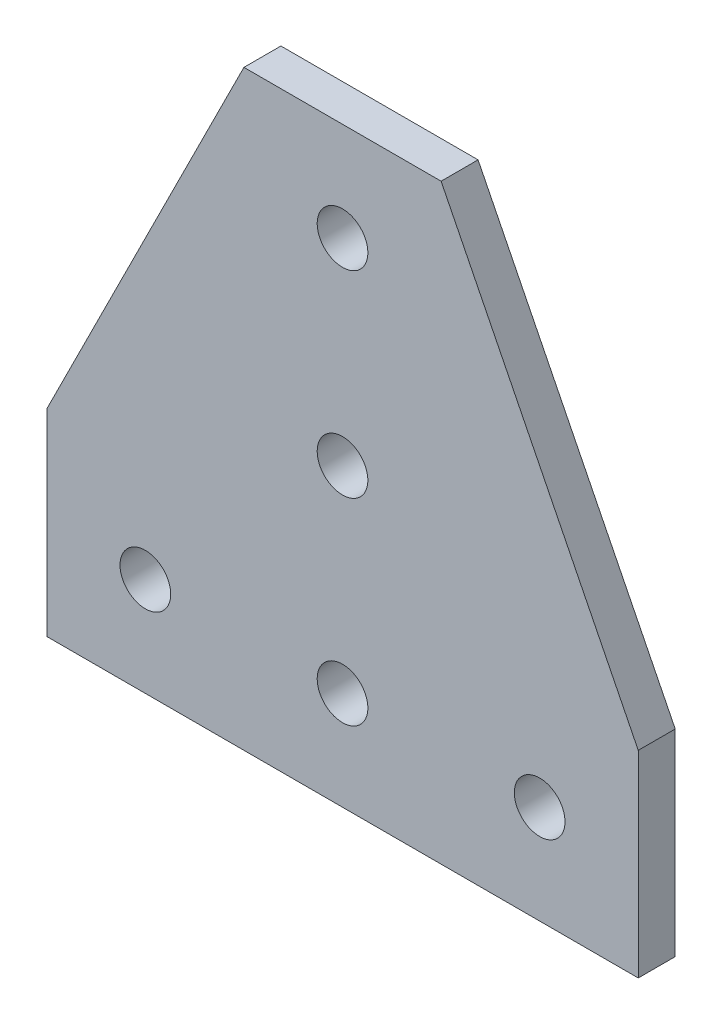
ISO-10303-21;
HEADER;
FILE_DESCRIPTION(('STEP AP214'),'2;1');
FILE_NAME('part.step','',(''),(''),'','','');
FILE_SCHEMA(('AUTOMOTIVE_DESIGN { 1 0 10303 214 1 1 1 1 }'));
ENDSEC;
DATA;
#1=APPLICATION_CONTEXT('core data for automotive mechanical design processes');
#2=APPLICATION_PROTOCOL_DEFINITION('international standard','automotive_design',2000,#1);
#3=PRODUCT_CONTEXT('',#1,'mechanical');
#4=PRODUCT('Part','Part','',(#3));
#5=PRODUCT_RELATED_PRODUCT_CATEGORY('part','',(#4));
#6=PRODUCT_DEFINITION_FORMATION('','',#4);
#7=PRODUCT_DEFINITION_CONTEXT('part definition',#1,'design');
#8=PRODUCT_DEFINITION('design','',#6,#7);
#9=PRODUCT_DEFINITION_SHAPE('','',#8);
#10=(LENGTH_UNIT() NAMED_UNIT(*) SI_UNIT(.MILLI.,.METRE.));
#11=(NAMED_UNIT(*) PLANE_ANGLE_UNIT() SI_UNIT($,.RADIAN.));
#12=(NAMED_UNIT(*) SI_UNIT($,.STERADIAN.) SOLID_ANGLE_UNIT());
#13=UNCERTAINTY_MEASURE_WITH_UNIT(LENGTH_MEASURE(1.E-05),#10,'distance_accuracy_value','');
#14=(GEOMETRIC_REPRESENTATION_CONTEXT(3) GLOBAL_UNCERTAINTY_ASSIGNED_CONTEXT((#13)) GLOBAL_UNIT_ASSIGNED_CONTEXT((#10,
#11,#12)) REPRESENTATION_CONTEXT('',''));
#15=CARTESIAN_POINT('',(0.,0.,0.));
#16=DIRECTION('',(0.,0.,1.));
#17=DIRECTION('',(1.,0.,0.));
#18=AXIS2_PLACEMENT_3D('',#15,#16,#17);
#19=CARTESIAN_POINT('',(0.,0.,2.38125));
#20=DIRECTION('',(0.,0.,-1.));
#21=DIRECTION('',(-1.,0.,0.));
#22=AXIS2_PLACEMENT_3D('',#19,#20,#21);
#23=PLANE('',#22);
#24=CARTESIAN_POINT('',(38.1,63.5,2.38125));
#25=DIRECTION('',(0.,0.,1.));
#26=DIRECTION('',(1.,0.,0.));
#27=AXIS2_PLACEMENT_3D('',#24,#25,#26);
#28=CIRCLE('',#27,3.26390000000001);
#29=CARTESIAN_POINT('',(34.8361,63.5,2.38125));
#30=VERTEX_POINT('',#29);
#31=EDGE_CURVE('E197',#30,#30,#28,.T.);
#32=ORIENTED_EDGE('',*,*,#31,.F.);
#33=EDGE_LOOP('',(#32));
#34=FACE_BOUND('',#33,.T.);
#35=CARTESIAN_POINT('',(38.1,12.7,2.38125));
#36=DIRECTION('',(0.,0.,1.));
#37=DIRECTION('',(1.,0.,0.));
#38=AXIS2_PLACEMENT_3D('',#35,#36,#37);
#39=CIRCLE('',#38,3.26389999999999);
#40=CARTESIAN_POINT('',(34.8361,12.7,2.38125));
#41=VERTEX_POINT('',#40);
#42=EDGE_CURVE('E209',#41,#41,#39,.T.);
#43=ORIENTED_EDGE('',*,*,#42,.F.);
#44=EDGE_LOOP('',(#43));
#45=FACE_BOUND('',#44,.T.);
#46=DIRECTION('',(1.,0.,0.));
#47=VECTOR('',#46,1.);
#48=CARTESIAN_POINT('',(76.2,0.,2.38125));
#49=LINE('',#48,#47);
#50=CARTESIAN_POINT('',(0.,0.,2.38125));
#51=VERTEX_POINT('',#50);
#52=CARTESIAN_POINT('',(76.2,0.,2.38125));
#53=VERTEX_POINT('',#52);
#54=EDGE_CURVE('E132',#51,#53,#49,.T.);
#55=ORIENTED_EDGE('',*,*,#54,.T.);
#56=DIRECTION('',(0.,1.,0.));
#57=VECTOR('',#56,1.);
#58=CARTESIAN_POINT('',(76.2,25.4,2.38125));
#59=LINE('',#58,#57);
#60=CARTESIAN_POINT('',(76.2,25.4,2.38125));
#61=VERTEX_POINT('',#60);
#62=EDGE_CURVE('E90',#53,#61,#59,.T.);
#63=ORIENTED_EDGE('',*,*,#62,.T.);
#64=DIRECTION('',(-0.447213595499958,0.894427190999916,0.));
#65=VECTOR('',#64,1.);
#66=CARTESIAN_POINT('',(76.2,25.4,2.38125));
#67=LINE('',#66,#65);
#68=CARTESIAN_POINT('',(50.8,76.2,2.38125));
#69=VERTEX_POINT('',#68);
#70=EDGE_CURVE('E103',#61,#69,#67,.T.);
#71=ORIENTED_EDGE('',*,*,#70,.T.);
#72=DIRECTION('',(-1.,0.,0.));
#73=VECTOR('',#72,1.);
#74=CARTESIAN_POINT('',(25.4,76.2,2.38125));
#75=LINE('',#74,#73);
#76=CARTESIAN_POINT('',(25.4,76.2,2.38125));
#77=VERTEX_POINT('',#76);
#78=EDGE_CURVE('E97',#69,#77,#75,.T.);
#79=ORIENTED_EDGE('',*,*,#78,.T.);
#80=DIRECTION('',(-0.447213595499958,-0.894427190999916,0.));
#81=VECTOR('',#80,1.);
#82=CARTESIAN_POINT('',(0.,25.4,2.38125));
#83=LINE('',#82,#81);
#84=CARTESIAN_POINT('',(0.,25.4,2.38125));
#85=VERTEX_POINT('',#84);
#86=EDGE_CURVE('E101',#77,#85,#83,.T.);
#87=ORIENTED_EDGE('',*,*,#86,.T.);
#88=DIRECTION('',(0.,-1.,0.));
#89=VECTOR('',#88,1.);
#90=CARTESIAN_POINT('',(0.,0.,2.38125));
#91=LINE('',#90,#89);
#92=EDGE_CURVE('E53',#85,#51,#91,.T.);
#93=ORIENTED_EDGE('',*,*,#92,.T.);
#94=EDGE_LOOP('',(#55,#63,#71,#79,#87,#93));
#95=FACE_BOUND('',#94,.T.);
#96=CARTESIAN_POINT('',(12.7,12.7,2.38125));
#97=DIRECTION('',(0.,0.,1.));
#98=DIRECTION('',(1.,0.,0.));
#99=AXIS2_PLACEMENT_3D('',#96,#97,#98);
#100=CIRCLE('',#99,3.2639);
#101=CARTESIAN_POINT('',(9.4361,12.7,2.38125));
#102=VERTEX_POINT('',#101);
#103=EDGE_CURVE('E125',#102,#102,#100,.T.);
#104=ORIENTED_EDGE('',*,*,#103,.F.);
#105=EDGE_LOOP('',(#104));
#106=FACE_BOUND('',#105,.T.);
#107=CARTESIAN_POINT('',(63.5,12.7,2.38125));
#108=DIRECTION('',(0.,0.,1.));
#109=DIRECTION('',(1.,0.,0.));
#110=AXIS2_PLACEMENT_3D('',#107,#108,#109);
#111=CIRCLE('',#110,3.26389999999999);
#112=CARTESIAN_POINT('',(60.2361,12.7,2.38125));
#113=VERTEX_POINT('',#112);
#114=EDGE_CURVE('E203',#113,#113,#111,.T.);
#115=ORIENTED_EDGE('',*,*,#114,.F.);
#116=EDGE_LOOP('',(#115));
#117=FACE_BOUND('',#116,.T.);
#118=CARTESIAN_POINT('',(38.1,38.1,2.38125));
#119=DIRECTION('',(0.,0.,1.));
#120=DIRECTION('',(1.,0.,0.));
#121=AXIS2_PLACEMENT_3D('',#118,#119,#120);
#122=CIRCLE('',#121,3.26389999999999);
#123=CARTESIAN_POINT('',(34.8361,38.1,2.38125));
#124=VERTEX_POINT('',#123);
#125=EDGE_CURVE('E188',#124,#124,#122,.T.);
#126=ORIENTED_EDGE('',*,*,#125,.F.);
#127=EDGE_LOOP('',(#126));
#128=FACE_BOUND('',#127,.T.);
#129=ADVANCED_FACE('F36',(#34,#45,#95,#106,#117,#128),#23,.F.);
#130=CARTESIAN_POINT('',(0.,0.,-2.38125));
#131=DIRECTION('',(0.,0.,-1.));
#132=DIRECTION('',(-1.,0.,0.));
#133=AXIS2_PLACEMENT_3D('',#130,#131,#132);
#134=PLANE('',#133);
#135=CARTESIAN_POINT('',(38.1,63.5,-2.38125));
#136=DIRECTION('',(0.,0.,1.));
#137=DIRECTION('',(1.,0.,0.));
#138=AXIS2_PLACEMENT_3D('',#135,#136,#137);
#139=CIRCLE('',#138,3.26390000000001);
#140=CARTESIAN_POINT('',(34.8361,63.5,-2.38125));
#141=VERTEX_POINT('',#140);
#142=EDGE_CURVE('E194',#141,#141,#139,.T.);
#143=ORIENTED_EDGE('',*,*,#142,.T.);
#144=EDGE_LOOP('',(#143));
#145=FACE_BOUND('',#144,.T.);
#146=CARTESIAN_POINT('',(38.1,12.7,-2.38125));
#147=DIRECTION('',(0.,0.,1.));
#148=DIRECTION('',(1.,0.,0.));
#149=AXIS2_PLACEMENT_3D('',#146,#147,#148);
#150=CIRCLE('',#149,3.26389999999999);
#151=CARTESIAN_POINT('',(34.8361,12.7,-2.38125));
#152=VERTEX_POINT('',#151);
#153=EDGE_CURVE('E206',#152,#152,#150,.T.);
#154=ORIENTED_EDGE('',*,*,#153,.T.);
#155=EDGE_LOOP('',(#154));
#156=FACE_BOUND('',#155,.T.);
#157=DIRECTION('',(1.,0.,0.));
#158=VECTOR('',#157,1.);
#159=CARTESIAN_POINT('',(76.2,0.,-2.38125));
#160=LINE('',#159,#158);
#161=CARTESIAN_POINT('',(0.,0.,-2.38125));
#162=VERTEX_POINT('',#161);
#163=CARTESIAN_POINT('',(76.2,0.,-2.38125));
#164=VERTEX_POINT('',#163);
#165=EDGE_CURVE('E121',#162,#164,#160,.T.);
#166=ORIENTED_EDGE('',*,*,#165,.F.);
#167=DIRECTION('',(0.,-1.,0.));
#168=VECTOR('',#167,1.);
#169=CARTESIAN_POINT('',(0.,0.,-2.38125));
#170=LINE('',#169,#168);
#171=CARTESIAN_POINT('',(0.,25.4,-2.38125));
#172=VERTEX_POINT('',#171);
#173=EDGE_CURVE('E82',#172,#162,#170,.T.);
#174=ORIENTED_EDGE('',*,*,#173,.F.);
#175=DIRECTION('',(-0.447213595499958,-0.894427190999916,0.));
#176=VECTOR('',#175,1.);
#177=CARTESIAN_POINT('',(0.,25.4,-2.38125));
#178=LINE('',#177,#176);
#179=CARTESIAN_POINT('',(25.4,76.2,-2.38125));
#180=VERTEX_POINT('',#179);
#181=EDGE_CURVE('E76',#180,#172,#178,.T.);
#182=ORIENTED_EDGE('',*,*,#181,.F.);
#183=DIRECTION('',(-1.,0.,0.));
#184=VECTOR('',#183,1.);
#185=CARTESIAN_POINT('',(25.4,76.2,-2.38125));
#186=LINE('',#185,#184);
#187=CARTESIAN_POINT('',(50.8,76.2,-2.38125));
#188=VERTEX_POINT('',#187);
#189=EDGE_CURVE('E111',#188,#180,#186,.T.);
#190=ORIENTED_EDGE('',*,*,#189,.F.);
#191=DIRECTION('',(-0.447213595499958,0.894427190999916,0.));
#192=VECTOR('',#191,1.);
#193=CARTESIAN_POINT('',(76.2,25.4,-2.38125));
#194=LINE('',#193,#192);
#195=CARTESIAN_POINT('',(76.2,25.4,-2.38125));
#196=VERTEX_POINT('',#195);
#197=EDGE_CURVE('E127',#196,#188,#194,.T.);
#198=ORIENTED_EDGE('',*,*,#197,.F.);
#199=DIRECTION('',(0.,1.,0.));
#200=VECTOR('',#199,1.);
#201=CARTESIAN_POINT('',(76.2,25.4,-2.38125));
#202=LINE('',#201,#200);
#203=EDGE_CURVE('E124',#164,#196,#202,.T.);
#204=ORIENTED_EDGE('',*,*,#203,.F.);
#205=EDGE_LOOP('',(#166,#174,#182,#190,#198,#204));
#206=FACE_BOUND('',#205,.T.);
#207=CARTESIAN_POINT('',(12.7,12.7,-2.38125));
#208=DIRECTION('',(0.,0.,1.));
#209=DIRECTION('',(1.,0.,0.));
#210=AXIS2_PLACEMENT_3D('',#207,#208,#209);
#211=CIRCLE('',#210,3.2639);
#212=CARTESIAN_POINT('',(9.4361,12.7,-2.38125));
#213=VERTEX_POINT('',#212);
#214=EDGE_CURVE('E212',#213,#213,#211,.T.);
#215=ORIENTED_EDGE('',*,*,#214,.T.);
#216=EDGE_LOOP('',(#215));
#217=FACE_BOUND('',#216,.T.);
#218=CARTESIAN_POINT('',(63.5,12.7,-2.38125));
#219=DIRECTION('',(0.,0.,1.));
#220=DIRECTION('',(1.,0.,0.));
#221=AXIS2_PLACEMENT_3D('',#218,#219,#220);
#222=CIRCLE('',#221,3.26389999999999);
#223=CARTESIAN_POINT('',(60.2361,12.7,-2.38125));
#224=VERTEX_POINT('',#223);
#225=EDGE_CURVE('E200',#224,#224,#222,.T.);
#226=ORIENTED_EDGE('',*,*,#225,.T.);
#227=EDGE_LOOP('',(#226));
#228=FACE_BOUND('',#227,.T.);
#229=CARTESIAN_POINT('',(38.1,38.1,-2.38125));
#230=DIRECTION('',(0.,0.,1.));
#231=DIRECTION('',(1.,0.,0.));
#232=AXIS2_PLACEMENT_3D('',#229,#230,#231);
#233=CIRCLE('',#232,3.26389999999999);
#234=CARTESIAN_POINT('',(34.8361,38.1,-2.38125));
#235=VERTEX_POINT('',#234);
#236=EDGE_CURVE('E191',#235,#235,#233,.T.);
#237=ORIENTED_EDGE('',*,*,#236,.T.);
#238=EDGE_LOOP('',(#237));
#239=FACE_BOUND('',#238,.T.);
#240=ADVANCED_FACE('F141',(#145,#156,#206,#217,#228,#239),#134,.T.);
#241=CARTESIAN_POINT('',(76.2,0.,2.38125));
#242=DIRECTION('',(0.,1.,0.));
#243=DIRECTION('',(-1.,0.,0.));
#244=AXIS2_PLACEMENT_3D('',#241,#242,#243);
#245=PLANE('',#244);
#246=ORIENTED_EDGE('',*,*,#165,.T.);
#247=DIRECTION('',(0.,0.,-1.));
#248=VECTOR('',#247,1.);
#249=CARTESIAN_POINT('',(76.2,0.,2.38125));
#250=LINE('',#249,#248);
#251=EDGE_CURVE('E11',#53,#164,#250,.T.);
#252=ORIENTED_EDGE('',*,*,#251,.F.);
#253=ORIENTED_EDGE('',*,*,#54,.F.);
#254=DIRECTION('',(0.,0.,-1.));
#255=VECTOR('',#254,1.);
#256=CARTESIAN_POINT('',(0.,0.,2.38125));
#257=LINE('',#256,#255);
#258=EDGE_CURVE('E117',#51,#162,#257,.T.);
#259=ORIENTED_EDGE('',*,*,#258,.T.);
#260=EDGE_LOOP('',(#246,#252,#253,#259));
#261=FACE_BOUND('',#260,.T.);
#262=ADVANCED_FACE('F38',(#261),#245,.F.);
#263=CARTESIAN_POINT('',(76.2,25.4,2.38125));
#264=DIRECTION('',(-1.,0.,0.));
#265=DIRECTION('',(0.,0.,1.));
#266=AXIS2_PLACEMENT_3D('',#263,#264,#265);
#267=PLANE('',#266);
#268=ORIENTED_EDGE('',*,*,#203,.T.);
#269=DIRECTION('',(0.,0.,-1.));
#270=VECTOR('',#269,1.);
#271=CARTESIAN_POINT('',(76.2,25.4,2.38125));
#272=LINE('',#271,#270);
#273=EDGE_CURVE('E45',#61,#196,#272,.T.);
#274=ORIENTED_EDGE('',*,*,#273,.F.);
#275=ORIENTED_EDGE('',*,*,#62,.F.);
#276=ORIENTED_EDGE('',*,*,#251,.T.);
#277=EDGE_LOOP('',(#268,#274,#275,#276));
#278=FACE_BOUND('',#277,.T.);
#279=ADVANCED_FACE('F278',(#278),#267,.F.);
#280=CARTESIAN_POINT('',(76.2,25.4,2.38125));
#281=DIRECTION('',(-0.894427190999916,-0.447213595499958,0.));
#282=DIRECTION('',(0.447213595499958,-0.894427190999916,0.));
#283=AXIS2_PLACEMENT_3D('',#280,#281,#282);
#284=PLANE('',#283);
#285=ORIENTED_EDGE('',*,*,#197,.T.);
#286=DIRECTION('',(0.,0.,-1.));
#287=VECTOR('',#286,1.);
#288=CARTESIAN_POINT('',(50.8,76.2,2.38125));
#289=LINE('',#288,#287);
#290=EDGE_CURVE('E112',#69,#188,#289,.T.);
#291=ORIENTED_EDGE('',*,*,#290,.F.);
#292=ORIENTED_EDGE('',*,*,#70,.F.);
#293=ORIENTED_EDGE('',*,*,#273,.T.);
#294=EDGE_LOOP('',(#285,#291,#292,#293));
#295=FACE_BOUND('',#294,.T.);
#296=ADVANCED_FACE('F138',(#295),#284,.F.);
#297=CARTESIAN_POINT('',(25.4,76.2,2.38125));
#298=DIRECTION('',(0.,-1.,0.));
#299=DIRECTION('',(0.,0.,-1.));
#300=AXIS2_PLACEMENT_3D('',#297,#298,#299);
#301=PLANE('',#300);
#302=ORIENTED_EDGE('',*,*,#189,.T.);
#303=DIRECTION('',(0.,0.,-1.));
#304=VECTOR('',#303,1.);
#305=CARTESIAN_POINT('',(25.4,76.2,2.38125));
#306=LINE('',#305,#304);
#307=EDGE_CURVE('E108',#77,#180,#306,.T.);
#308=ORIENTED_EDGE('',*,*,#307,.F.);
#309=ORIENTED_EDGE('',*,*,#78,.F.);
#310=ORIENTED_EDGE('',*,*,#290,.T.);
#311=EDGE_LOOP('',(#302,#308,#309,#310));
#312=FACE_BOUND('',#311,.T.);
#313=ADVANCED_FACE('F109',(#312),#301,.F.);
#314=CARTESIAN_POINT('',(0.,25.4,2.38125));
#315=DIRECTION('',(0.894427190999916,-0.447213595499958,0.));
#316=DIRECTION('',(0.447213595499958,0.894427190999916,0.));
#317=AXIS2_PLACEMENT_3D('',#314,#315,#316);
#318=PLANE('',#317);
#319=ORIENTED_EDGE('',*,*,#181,.T.);
#320=DIRECTION('',(0.,0.,-1.));
#321=VECTOR('',#320,1.);
#322=CARTESIAN_POINT('',(0.,25.4,2.38125));
#323=LINE('',#322,#321);
#324=EDGE_CURVE('E113',#85,#172,#323,.T.);
#325=ORIENTED_EDGE('',*,*,#324,.F.);
#326=ORIENTED_EDGE('',*,*,#86,.F.);
#327=ORIENTED_EDGE('',*,*,#307,.T.);
#328=EDGE_LOOP('',(#319,#325,#326,#327));
#329=FACE_BOUND('',#328,.T.);
#330=ADVANCED_FACE('F115',(#329),#318,.F.);
#331=CARTESIAN_POINT('',(0.,0.,2.38125));
#332=DIRECTION('',(1.,0.,0.));
#333=DIRECTION('',(0.,0.,-1.));
#334=AXIS2_PLACEMENT_3D('',#331,#332,#333);
#335=PLANE('',#334);
#336=ORIENTED_EDGE('',*,*,#173,.T.);
#337=ORIENTED_EDGE('',*,*,#258,.F.);
#338=ORIENTED_EDGE('',*,*,#92,.F.);
#339=ORIENTED_EDGE('',*,*,#324,.T.);
#340=EDGE_LOOP('',(#336,#337,#338,#339));
#341=FACE_BOUND('',#340,.T.);
#342=ADVANCED_FACE('F146',(#341),#335,.F.);
#343=CARTESIAN_POINT('',(12.7,12.7,2.38125));
#344=DIRECTION('',(0.,0.,-1.));
#345=DIRECTION('',(-1.,0.,0.));
#346=AXIS2_PLACEMENT_3D('',#343,#344,#345);
#347=CYLINDRICAL_SURFACE('',#346,3.2639);
#348=CARTESIAN_POINT('',(9.4361,12.7,2.38125));
#349=CARTESIAN_POINT('',(9.4361,12.7,2.331640625));
#350=CARTESIAN_POINT('',(9.4361,12.7,2.28203125));
#351=CARTESIAN_POINT('',(9.4361,12.7,2.1828125));
#352=CARTESIAN_POINT('',(9.4361,12.7,2.133203125));
#353=CARTESIAN_POINT('',(9.4361,12.7,2.033984375));
#354=CARTESIAN_POINT('',(9.4361,12.7,1.984375));
#355=CARTESIAN_POINT('',(9.4361,12.7,1.88515625));
#356=CARTESIAN_POINT('',(9.4361,12.7,1.835546875));
#357=CARTESIAN_POINT('',(9.4361,12.7,1.736328125));
#358=CARTESIAN_POINT('',(9.4361,12.7,1.68671875));
#359=CARTESIAN_POINT('',(9.4361,12.7,1.5875));
#360=CARTESIAN_POINT('',(9.4361,12.7,1.537890625));
#361=CARTESIAN_POINT('',(9.4361,12.7,1.438671875));
#362=CARTESIAN_POINT('',(9.4361,12.7,1.3890625));
#363=CARTESIAN_POINT('',(9.4361,12.7,1.28984375));
#364=CARTESIAN_POINT('',(9.4361,12.7,1.240234375));
#365=CARTESIAN_POINT('',(9.4361,12.7,1.141015625));
#366=CARTESIAN_POINT('',(9.4361,12.7,1.09140625));
#367=CARTESIAN_POINT('',(9.4361,12.7,0.9921875));
#368=CARTESIAN_POINT('',(9.4361,12.7,0.942578125));
#369=CARTESIAN_POINT('',(9.4361,12.7,0.843359375));
#370=CARTESIAN_POINT('',(9.4361,12.7,0.79375));
#371=CARTESIAN_POINT('',(9.4361,12.7,0.69453125));
#372=CARTESIAN_POINT('',(9.4361,12.7,0.644921875));
#373=CARTESIAN_POINT('',(9.4361,12.7,0.545703125));
#374=CARTESIAN_POINT('',(9.4361,12.7,0.49609375));
#375=CARTESIAN_POINT('',(9.4361,12.7,0.396875));
#376=CARTESIAN_POINT('',(9.4361,12.7,0.347265625));
#377=CARTESIAN_POINT('',(9.4361,12.7,0.248046875));
#378=CARTESIAN_POINT('',(9.4361,12.7,0.1984375));
#379=CARTESIAN_POINT('',(9.4361,12.7,0.0992187499999996));
#380=CARTESIAN_POINT('',(9.4361,12.7,0.0496093749999996));
#381=CARTESIAN_POINT('',(9.4361,12.7,-0.0496093750000005));
#382=CARTESIAN_POINT('',(9.4361,12.7,-0.0992187500000005));
#383=CARTESIAN_POINT('',(9.4361,12.7,-0.198437500000001));
#384=CARTESIAN_POINT('',(9.4361,12.7,-0.248046875000001));
#385=CARTESIAN_POINT('',(9.4361,12.7,-0.347265625000001));
#386=CARTESIAN_POINT('',(9.4361,12.7,-0.396875000000001));
#387=CARTESIAN_POINT('',(9.4361,12.7,-0.496093750000001));
#388=CARTESIAN_POINT('',(9.4361,12.7,-0.545703125000001));
#389=CARTESIAN_POINT('',(9.4361,12.7,-0.644921875000001));
#390=CARTESIAN_POINT('',(9.4361,12.7,-0.694531250000001));
#391=CARTESIAN_POINT('',(9.4361,12.7,-0.793750000000001));
#392=CARTESIAN_POINT('',(9.4361,12.7,-0.843359375));
#393=CARTESIAN_POINT('',(9.4361,12.7,-0.942578125000001));
#394=CARTESIAN_POINT('',(9.4361,12.7,-0.992187500000001));
#395=CARTESIAN_POINT('',(9.4361,12.7,-1.09140625));
#396=CARTESIAN_POINT('',(9.4361,12.7,-1.141015625));
#397=CARTESIAN_POINT('',(9.4361,12.7,-1.240234375));
#398=CARTESIAN_POINT('',(9.4361,12.7,-1.28984375));
#399=CARTESIAN_POINT('',(9.4361,12.7,-1.3890625));
#400=CARTESIAN_POINT('',(9.4361,12.7,-1.438671875));
#401=CARTESIAN_POINT('',(9.4361,12.7,-1.537890625));
#402=CARTESIAN_POINT('',(9.4361,12.7,-1.5875));
#403=CARTESIAN_POINT('',(9.4361,12.7,-1.68671875));
#404=CARTESIAN_POINT('',(9.4361,12.7,-1.736328125));
#405=CARTESIAN_POINT('',(9.4361,12.7,-1.835546875));
#406=CARTESIAN_POINT('',(9.4361,12.7,-1.88515625));
#407=CARTESIAN_POINT('',(9.4361,12.7,-1.984375));
#408=CARTESIAN_POINT('',(9.4361,12.7,-2.033984375));
#409=CARTESIAN_POINT('',(9.4361,12.7,-2.133203125));
#410=CARTESIAN_POINT('',(9.4361,12.7,-2.1828125));
#411=CARTESIAN_POINT('',(9.4361,12.7,-2.28203125));
#412=CARTESIAN_POINT('',(9.4361,12.7,-2.331640625));
#413=CARTESIAN_POINT('',(9.4361,12.7,-2.38125));
#414=B_SPLINE_CURVE_WITH_KNOTS('',3,(#348,#349,#350,#351,#352,#353,#354,#355,#356,#357,#358,
#359,#360,#361,#362,#363,#364,#365,#366,#367,#368,#369,#370,#371,#372,#373,#374,#375,#376,#377,
#378,#379,#380,#381,#382,#383,#384,#385,#386,#387,#388,#389,#390,#391,#392,#393,#394,#395,#396,
#397,#398,#399,#400,#401,#402,#403,#404,#405,#406,#407,#408,#409,#410,#411,#412,#413),
.UNSPECIFIED.,.F.,.F.,(4,2,2,2,2,2,2,2,2,2,2,2,2,2,2,2,2,2,2,2,2,2,2,2,2,2,2,2,2,2,2,2,4),(0.,
0.148828125,0.29765625,0.446484375,0.5953125,0.744140625,0.89296875,1.041796875,1.190625,
1.339453125,1.48828125,1.637109375,1.7859375,1.934765625,2.08359375,2.232421875,2.38125,
2.530078125,2.67890625,2.827734375,2.9765625,3.125390625,3.27421875,3.423046875,3.571875,
3.720703125,3.86953125,4.018359375,4.1671875,4.316015625,4.46484375,4.613671875,4.7625),.UNSPECIFIED.);
#415=EDGE_CURVE('BSEAM148',#102,#213,#414,.T.);
#416=ORIENTED_EDGE('',*,*,#103,.T.);
#417=ORIENTED_EDGE('',*,*,#214,.F.);
#418=ORIENTED_EDGE('',*,*,#415,.T.);
#419=ORIENTED_EDGE('',*,*,#415,.F.);
#420=EDGE_LOOP('',(#416,#418,#417,#419));
#421=FACE_BOUND('',#420,.T.);
#422=ADVANCED_FACE('F148',(#421),#347,.F.);
#423=CARTESIAN_POINT('',(38.1,12.7,2.38125));
#424=DIRECTION('',(0.,0.,-1.));
#425=DIRECTION('',(-1.,0.,0.));
#426=AXIS2_PLACEMENT_3D('',#423,#424,#425);
#427=CYLINDRICAL_SURFACE('',#426,3.26389999999999);
#428=CARTESIAN_POINT('',(34.8361,12.7,2.38125));
#429=CARTESIAN_POINT('',(34.8361,12.7,2.331640625));
#430=CARTESIAN_POINT('',(34.8361,12.7,2.28203125));
#431=CARTESIAN_POINT('',(34.8361,12.7,2.1828125));
#432=CARTESIAN_POINT('',(34.8361,12.7,2.133203125));
#433=CARTESIAN_POINT('',(34.8361,12.7,2.033984375));
#434=CARTESIAN_POINT('',(34.8361,12.7,1.984375));
#435=CARTESIAN_POINT('',(34.8361,12.7,1.88515625));
#436=CARTESIAN_POINT('',(34.8361,12.7,1.835546875));
#437=CARTESIAN_POINT('',(34.8361,12.7,1.736328125));
#438=CARTESIAN_POINT('',(34.8361,12.7,1.68671875));
#439=CARTESIAN_POINT('',(34.8361,12.7,1.5875));
#440=CARTESIAN_POINT('',(34.8361,12.7,1.537890625));
#441=CARTESIAN_POINT('',(34.8361,12.7,1.438671875));
#442=CARTESIAN_POINT('',(34.8361,12.7,1.3890625));
#443=CARTESIAN_POINT('',(34.8361,12.7,1.28984375));
#444=CARTESIAN_POINT('',(34.8361,12.7,1.240234375));
#445=CARTESIAN_POINT('',(34.8361,12.7,1.141015625));
#446=CARTESIAN_POINT('',(34.8361,12.7,1.09140625));
#447=CARTESIAN_POINT('',(34.8361,12.7,0.9921875));
#448=CARTESIAN_POINT('',(34.8361,12.7,0.942578125));
#449=CARTESIAN_POINT('',(34.8361,12.7,0.843359375));
#450=CARTESIAN_POINT('',(34.8361,12.7,0.79375));
#451=CARTESIAN_POINT('',(34.8361,12.7,0.69453125));
#452=CARTESIAN_POINT('',(34.8361,12.7,0.644921875));
#453=CARTESIAN_POINT('',(34.8361,12.7,0.545703125));
#454=CARTESIAN_POINT('',(34.8361,12.7,0.49609375));
#455=CARTESIAN_POINT('',(34.8361,12.7,0.396875));
#456=CARTESIAN_POINT('',(34.8361,12.7,0.347265625));
#457=CARTESIAN_POINT('',(34.8361,12.7,0.248046875));
#458=CARTESIAN_POINT('',(34.8361,12.7,0.1984375));
#459=CARTESIAN_POINT('',(34.8361,12.7,0.0992187499999996));
#460=CARTESIAN_POINT('',(34.8361,12.7,0.0496093749999996));
#461=CARTESIAN_POINT('',(34.8361,12.7,-0.0496093750000005));
#462=CARTESIAN_POINT('',(34.8361,12.7,-0.0992187500000005));
#463=CARTESIAN_POINT('',(34.8361,12.7,-0.198437500000001));
#464=CARTESIAN_POINT('',(34.8361,12.7,-0.248046875000001));
#465=CARTESIAN_POINT('',(34.8361,12.7,-0.347265625000001));
#466=CARTESIAN_POINT('',(34.8361,12.7,-0.396875000000001));
#467=CARTESIAN_POINT('',(34.8361,12.7,-0.496093750000001));
#468=CARTESIAN_POINT('',(34.8361,12.7,-0.545703125000001));
#469=CARTESIAN_POINT('',(34.8361,12.7,-0.644921875000001));
#470=CARTESIAN_POINT('',(34.8361,12.7,-0.694531250000001));
#471=CARTESIAN_POINT('',(34.8361,12.7,-0.793750000000001));
#472=CARTESIAN_POINT('',(34.8361,12.7,-0.843359375));
#473=CARTESIAN_POINT('',(34.8361,12.7,-0.942578125000001));
#474=CARTESIAN_POINT('',(34.8361,12.7,-0.992187500000001));
#475=CARTESIAN_POINT('',(34.8361,12.7,-1.09140625));
#476=CARTESIAN_POINT('',(34.8361,12.7,-1.141015625));
#477=CARTESIAN_POINT('',(34.8361,12.7,-1.240234375));
#478=CARTESIAN_POINT('',(34.8361,12.7,-1.28984375));
#479=CARTESIAN_POINT('',(34.8361,12.7,-1.3890625));
#480=CARTESIAN_POINT('',(34.8361,12.7,-1.438671875));
#481=CARTESIAN_POINT('',(34.8361,12.7,-1.537890625));
#482=CARTESIAN_POINT('',(34.8361,12.7,-1.5875));
#483=CARTESIAN_POINT('',(34.8361,12.7,-1.68671875));
#484=CARTESIAN_POINT('',(34.8361,12.7,-1.736328125));
#485=CARTESIAN_POINT('',(34.8361,12.7,-1.835546875));
#486=CARTESIAN_POINT('',(34.8361,12.7,-1.88515625));
#487=CARTESIAN_POINT('',(34.8361,12.7,-1.984375));
#488=CARTESIAN_POINT('',(34.8361,12.7,-2.033984375));
#489=CARTESIAN_POINT('',(34.8361,12.7,-2.133203125));
#490=CARTESIAN_POINT('',(34.8361,12.7,-2.1828125));
#491=CARTESIAN_POINT('',(34.8361,12.7,-2.28203125));
#492=CARTESIAN_POINT('',(34.8361,12.7,-2.331640625));
#493=CARTESIAN_POINT('',(34.8361,12.7,-2.38125));
#494=B_SPLINE_CURVE_WITH_KNOTS('',3,(#428,#429,#430,#431,#432,#433,#434,#435,#436,#437,#438,
#439,#440,#441,#442,#443,#444,#445,#446,#447,#448,#449,#450,#451,#452,#453,#454,#455,#456,#457,
#458,#459,#460,#461,#462,#463,#464,#465,#466,#467,#468,#469,#470,#471,#472,#473,#474,#475,#476,
#477,#478,#479,#480,#481,#482,#483,#484,#485,#486,#487,#488,#489,#490,#491,#492,#493),
.UNSPECIFIED.,.F.,.F.,(4,2,2,2,2,2,2,2,2,2,2,2,2,2,2,2,2,2,2,2,2,2,2,2,2,2,2,2,2,2,2,2,4),(0.,
0.148828125,0.29765625,0.446484375,0.5953125,0.744140625,0.89296875,1.041796875,1.190625,
1.339453125,1.48828125,1.637109375,1.7859375,1.934765625,2.08359375,2.232421875,2.38125,
2.530078125,2.67890625,2.827734375,2.9765625,3.125390625,3.27421875,3.423046875,3.571875,
3.720703125,3.86953125,4.018359375,4.1671875,4.316015625,4.46484375,4.613671875,4.7625),.UNSPECIFIED.);
#495=EDGE_CURVE('BSEAM154',#41,#152,#494,.T.);
#496=ORIENTED_EDGE('',*,*,#42,.T.);
#497=ORIENTED_EDGE('',*,*,#153,.F.);
#498=ORIENTED_EDGE('',*,*,#495,.T.);
#499=ORIENTED_EDGE('',*,*,#495,.F.);
#500=EDGE_LOOP('',(#496,#498,#497,#499));
#501=FACE_BOUND('',#500,.T.);
#502=ADVANCED_FACE('F154',(#501),#427,.F.);
#503=CARTESIAN_POINT('',(63.5,12.7,2.38125));
#504=DIRECTION('',(0.,0.,-1.));
#505=DIRECTION('',(-1.,0.,0.));
#506=AXIS2_PLACEMENT_3D('',#503,#504,#505);
#507=CYLINDRICAL_SURFACE('',#506,3.26389999999999);
#508=CARTESIAN_POINT('',(60.2361,12.7,2.38125));
#509=CARTESIAN_POINT('',(60.2361,12.7,2.331640625));
#510=CARTESIAN_POINT('',(60.2361,12.7,2.28203125));
#511=CARTESIAN_POINT('',(60.2361,12.7,2.1828125));
#512=CARTESIAN_POINT('',(60.2361,12.7,2.133203125));
#513=CARTESIAN_POINT('',(60.2361,12.7,2.033984375));
#514=CARTESIAN_POINT('',(60.2361,12.7,1.984375));
#515=CARTESIAN_POINT('',(60.2361,12.7,1.88515625));
#516=CARTESIAN_POINT('',(60.2361,12.7,1.835546875));
#517=CARTESIAN_POINT('',(60.2361,12.7,1.736328125));
#518=CARTESIAN_POINT('',(60.2361,12.7,1.68671875));
#519=CARTESIAN_POINT('',(60.2361,12.7,1.5875));
#520=CARTESIAN_POINT('',(60.2361,12.7,1.537890625));
#521=CARTESIAN_POINT('',(60.2361,12.7,1.438671875));
#522=CARTESIAN_POINT('',(60.2361,12.7,1.3890625));
#523=CARTESIAN_POINT('',(60.2361,12.7,1.28984375));
#524=CARTESIAN_POINT('',(60.2361,12.7,1.240234375));
#525=CARTESIAN_POINT('',(60.2361,12.7,1.141015625));
#526=CARTESIAN_POINT('',(60.2361,12.7,1.09140625));
#527=CARTESIAN_POINT('',(60.2361,12.7,0.9921875));
#528=CARTESIAN_POINT('',(60.2361,12.7,0.942578125));
#529=CARTESIAN_POINT('',(60.2361,12.7,0.843359375));
#530=CARTESIAN_POINT('',(60.2361,12.7,0.79375));
#531=CARTESIAN_POINT('',(60.2361,12.7,0.69453125));
#532=CARTESIAN_POINT('',(60.2361,12.7,0.644921875));
#533=CARTESIAN_POINT('',(60.2361,12.7,0.545703125));
#534=CARTESIAN_POINT('',(60.2361,12.7,0.49609375));
#535=CARTESIAN_POINT('',(60.2361,12.7,0.396875));
#536=CARTESIAN_POINT('',(60.2361,12.7,0.347265625));
#537=CARTESIAN_POINT('',(60.2361,12.7,0.248046875));
#538=CARTESIAN_POINT('',(60.2361,12.7,0.1984375));
#539=CARTESIAN_POINT('',(60.2361,12.7,0.0992187499999996));
#540=CARTESIAN_POINT('',(60.2361,12.7,0.0496093749999996));
#541=CARTESIAN_POINT('',(60.2361,12.7,-0.0496093750000005));
#542=CARTESIAN_POINT('',(60.2361,12.7,-0.0992187500000005));
#543=CARTESIAN_POINT('',(60.2361,12.7,-0.198437500000001));
#544=CARTESIAN_POINT('',(60.2361,12.7,-0.248046875000001));
#545=CARTESIAN_POINT('',(60.2361,12.7,-0.347265625000001));
#546=CARTESIAN_POINT('',(60.2361,12.7,-0.396875000000001));
#547=CARTESIAN_POINT('',(60.2361,12.7,-0.496093750000001));
#548=CARTESIAN_POINT('',(60.2361,12.7,-0.545703125000001));
#549=CARTESIAN_POINT('',(60.2361,12.7,-0.644921875000001));
#550=CARTESIAN_POINT('',(60.2361,12.7,-0.694531250000001));
#551=CARTESIAN_POINT('',(60.2361,12.7,-0.793750000000001));
#552=CARTESIAN_POINT('',(60.2361,12.7,-0.843359375));
#553=CARTESIAN_POINT('',(60.2361,12.7,-0.942578125000001));
#554=CARTESIAN_POINT('',(60.2361,12.7,-0.992187500000001));
#555=CARTESIAN_POINT('',(60.2361,12.7,-1.09140625));
#556=CARTESIAN_POINT('',(60.2361,12.7,-1.141015625));
#557=CARTESIAN_POINT('',(60.2361,12.7,-1.240234375));
#558=CARTESIAN_POINT('',(60.2361,12.7,-1.28984375));
#559=CARTESIAN_POINT('',(60.2361,12.7,-1.3890625));
#560=CARTESIAN_POINT('',(60.2361,12.7,-1.438671875));
#561=CARTESIAN_POINT('',(60.2361,12.7,-1.537890625));
#562=CARTESIAN_POINT('',(60.2361,12.7,-1.5875));
#563=CARTESIAN_POINT('',(60.2361,12.7,-1.68671875));
#564=CARTESIAN_POINT('',(60.2361,12.7,-1.736328125));
#565=CARTESIAN_POINT('',(60.2361,12.7,-1.835546875));
#566=CARTESIAN_POINT('',(60.2361,12.7,-1.88515625));
#567=CARTESIAN_POINT('',(60.2361,12.7,-1.984375));
#568=CARTESIAN_POINT('',(60.2361,12.7,-2.033984375));
#569=CARTESIAN_POINT('',(60.2361,12.7,-2.133203125));
#570=CARTESIAN_POINT('',(60.2361,12.7,-2.1828125));
#571=CARTESIAN_POINT('',(60.2361,12.7,-2.28203125));
#572=CARTESIAN_POINT('',(60.2361,12.7,-2.331640625));
#573=CARTESIAN_POINT('',(60.2361,12.7,-2.38125));
#574=B_SPLINE_CURVE_WITH_KNOTS('',3,(#508,#509,#510,#511,#512,#513,#514,#515,#516,#517,#518,
#519,#520,#521,#522,#523,#524,#525,#526,#527,#528,#529,#530,#531,#532,#533,#534,#535,#536,#537,
#538,#539,#540,#541,#542,#543,#544,#545,#546,#547,#548,#549,#550,#551,#552,#553,#554,#555,#556,
#557,#558,#559,#560,#561,#562,#563,#564,#565,#566,#567,#568,#569,#570,#571,#572,#573),
.UNSPECIFIED.,.F.,.F.,(4,2,2,2,2,2,2,2,2,2,2,2,2,2,2,2,2,2,2,2,2,2,2,2,2,2,2,2,2,2,2,2,4),(0.,
0.148828125,0.29765625,0.446484375,0.5953125,0.744140625,0.89296875,1.041796875,1.190625,
1.339453125,1.48828125,1.637109375,1.7859375,1.934765625,2.08359375,2.232421875,2.38125,
2.530078125,2.67890625,2.827734375,2.9765625,3.125390625,3.27421875,3.423046875,3.571875,
3.720703125,3.86953125,4.018359375,4.1671875,4.316015625,4.46484375,4.613671875,4.7625),.UNSPECIFIED.);
#575=EDGE_CURVE('BSEAM171',#113,#224,#574,.T.);
#576=ORIENTED_EDGE('',*,*,#114,.T.);
#577=ORIENTED_EDGE('',*,*,#225,.F.);
#578=ORIENTED_EDGE('',*,*,#575,.T.);
#579=ORIENTED_EDGE('',*,*,#575,.F.);
#580=EDGE_LOOP('',(#576,#578,#577,#579));
#581=FACE_BOUND('',#580,.T.);
#582=ADVANCED_FACE('F171',(#581),#507,.F.);
#583=CARTESIAN_POINT('',(38.1,63.5,2.38125));
#584=DIRECTION('',(0.,0.,-1.));
#585=DIRECTION('',(-1.,0.,0.));
#586=AXIS2_PLACEMENT_3D('',#583,#584,#585);
#587=CYLINDRICAL_SURFACE('',#586,3.26390000000001);
#588=CARTESIAN_POINT('',(34.8361,63.5,2.38125));
#589=CARTESIAN_POINT('',(34.8361,63.5,2.331640625));
#590=CARTESIAN_POINT('',(34.8361,63.5,2.28203125));
#591=CARTESIAN_POINT('',(34.8361,63.5,2.1828125));
#592=CARTESIAN_POINT('',(34.8361,63.5,2.133203125));
#593=CARTESIAN_POINT('',(34.8361,63.5,2.033984375));
#594=CARTESIAN_POINT('',(34.8361,63.5,1.984375));
#595=CARTESIAN_POINT('',(34.8361,63.5,1.88515625));
#596=CARTESIAN_POINT('',(34.8361,63.5,1.835546875));
#597=CARTESIAN_POINT('',(34.8361,63.5,1.736328125));
#598=CARTESIAN_POINT('',(34.8361,63.5,1.68671875));
#599=CARTESIAN_POINT('',(34.8361,63.5,1.5875));
#600=CARTESIAN_POINT('',(34.8361,63.5,1.537890625));
#601=CARTESIAN_POINT('',(34.8361,63.5,1.438671875));
#602=CARTESIAN_POINT('',(34.8361,63.5,1.3890625));
#603=CARTESIAN_POINT('',(34.8361,63.5,1.28984375));
#604=CARTESIAN_POINT('',(34.8361,63.5,1.240234375));
#605=CARTESIAN_POINT('',(34.8361,63.5,1.141015625));
#606=CARTESIAN_POINT('',(34.8361,63.5,1.09140625));
#607=CARTESIAN_POINT('',(34.8361,63.5,0.9921875));
#608=CARTESIAN_POINT('',(34.8361,63.5,0.942578125));
#609=CARTESIAN_POINT('',(34.8361,63.5,0.843359375));
#610=CARTESIAN_POINT('',(34.8361,63.5,0.79375));
#611=CARTESIAN_POINT('',(34.8361,63.5,0.69453125));
#612=CARTESIAN_POINT('',(34.8361,63.5,0.644921875));
#613=CARTESIAN_POINT('',(34.8361,63.5,0.545703125));
#614=CARTESIAN_POINT('',(34.8361,63.5,0.49609375));
#615=CARTESIAN_POINT('',(34.8361,63.5,0.396875));
#616=CARTESIAN_POINT('',(34.8361,63.5,0.347265625));
#617=CARTESIAN_POINT('',(34.8361,63.5,0.248046875));
#618=CARTESIAN_POINT('',(34.8361,63.5,0.1984375));
#619=CARTESIAN_POINT('',(34.8361,63.5,0.0992187499999996));
#620=CARTESIAN_POINT('',(34.8361,63.5,0.0496093749999996));
#621=CARTESIAN_POINT('',(34.8361,63.5,-0.0496093750000005));
#622=CARTESIAN_POINT('',(34.8361,63.5,-0.0992187500000005));
#623=CARTESIAN_POINT('',(34.8361,63.5,-0.198437500000001));
#624=CARTESIAN_POINT('',(34.8361,63.5,-0.248046875000001));
#625=CARTESIAN_POINT('',(34.8361,63.5,-0.347265625000001));
#626=CARTESIAN_POINT('',(34.8361,63.5,-0.396875000000001));
#627=CARTESIAN_POINT('',(34.8361,63.5,-0.496093750000001));
#628=CARTESIAN_POINT('',(34.8361,63.5,-0.545703125000001));
#629=CARTESIAN_POINT('',(34.8361,63.5,-0.644921875000001));
#630=CARTESIAN_POINT('',(34.8361,63.5,-0.694531250000001));
#631=CARTESIAN_POINT('',(34.8361,63.5,-0.793750000000001));
#632=CARTESIAN_POINT('',(34.8361,63.5,-0.843359375));
#633=CARTESIAN_POINT('',(34.8361,63.5,-0.942578125000001));
#634=CARTESIAN_POINT('',(34.8361,63.5,-0.992187500000001));
#635=CARTESIAN_POINT('',(34.8361,63.5,-1.09140625));
#636=CARTESIAN_POINT('',(34.8361,63.5,-1.141015625));
#637=CARTESIAN_POINT('',(34.8361,63.5,-1.240234375));
#638=CARTESIAN_POINT('',(34.8361,63.5,-1.28984375));
#639=CARTESIAN_POINT('',(34.8361,63.5,-1.3890625));
#640=CARTESIAN_POINT('',(34.8361,63.5,-1.438671875));
#641=CARTESIAN_POINT('',(34.8361,63.5,-1.537890625));
#642=CARTESIAN_POINT('',(34.8361,63.5,-1.5875));
#643=CARTESIAN_POINT('',(34.8361,63.5,-1.68671875));
#644=CARTESIAN_POINT('',(34.8361,63.5,-1.736328125));
#645=CARTESIAN_POINT('',(34.8361,63.5,-1.835546875));
#646=CARTESIAN_POINT('',(34.8361,63.5,-1.88515625));
#647=CARTESIAN_POINT('',(34.8361,63.5,-1.984375));
#648=CARTESIAN_POINT('',(34.8361,63.5,-2.033984375));
#649=CARTESIAN_POINT('',(34.8361,63.5,-2.133203125));
#650=CARTESIAN_POINT('',(34.8361,63.5,-2.1828125));
#651=CARTESIAN_POINT('',(34.8361,63.5,-2.28203125));
#652=CARTESIAN_POINT('',(34.8361,63.5,-2.331640625));
#653=CARTESIAN_POINT('',(34.8361,63.5,-2.38125));
#654=B_SPLINE_CURVE_WITH_KNOTS('',3,(#588,#589,#590,#591,#592,#593,#594,#595,#596,#597,#598,
#599,#600,#601,#602,#603,#604,#605,#606,#607,#608,#609,#610,#611,#612,#613,#614,#615,#616,#617,
#618,#619,#620,#621,#622,#623,#624,#625,#626,#627,#628,#629,#630,#631,#632,#633,#634,#635,#636,
#637,#638,#639,#640,#641,#642,#643,#644,#645,#646,#647,#648,#649,#650,#651,#652,#653),
.UNSPECIFIED.,.F.,.F.,(4,2,2,2,2,2,2,2,2,2,2,2,2,2,2,2,2,2,2,2,2,2,2,2,2,2,2,2,2,2,2,2,4),(0.,
0.148828125,0.29765625,0.446484375,0.5953125,0.744140625,0.89296875,1.041796875,1.190625,
1.339453125,1.48828125,1.637109375,1.7859375,1.934765625,2.08359375,2.232421875,2.38125,
2.530078125,2.67890625,2.827734375,2.9765625,3.125390625,3.27421875,3.423046875,3.571875,
3.720703125,3.86953125,4.018359375,4.1671875,4.316015625,4.46484375,4.613671875,4.7625),.UNSPECIFIED.);
#655=EDGE_CURVE('BSEAM175',#30,#141,#654,.T.);
#656=ORIENTED_EDGE('',*,*,#31,.T.);
#657=ORIENTED_EDGE('',*,*,#142,.F.);
#658=ORIENTED_EDGE('',*,*,#655,.T.);
#659=ORIENTED_EDGE('',*,*,#655,.F.);
#660=EDGE_LOOP('',(#656,#658,#657,#659));
#661=FACE_BOUND('',#660,.T.);
#662=ADVANCED_FACE('F175',(#661),#587,.F.);
#663=CARTESIAN_POINT('',(38.1,38.1,2.38125));
#664=DIRECTION('',(0.,0.,-1.));
#665=DIRECTION('',(-1.,0.,0.));
#666=AXIS2_PLACEMENT_3D('',#663,#664,#665);
#667=CYLINDRICAL_SURFACE('',#666,3.26389999999999);
#668=CARTESIAN_POINT('',(34.8361,38.1,2.38125));
#669=CARTESIAN_POINT('',(34.8361,38.1,2.331640625));
#670=CARTESIAN_POINT('',(34.8361,38.1,2.28203125));
#671=CARTESIAN_POINT('',(34.8361,38.1,2.1828125));
#672=CARTESIAN_POINT('',(34.8361,38.1,2.133203125));
#673=CARTESIAN_POINT('',(34.8361,38.1,2.033984375));
#674=CARTESIAN_POINT('',(34.8361,38.1,1.984375));
#675=CARTESIAN_POINT('',(34.8361,38.1,1.88515625));
#676=CARTESIAN_POINT('',(34.8361,38.1,1.835546875));
#677=CARTESIAN_POINT('',(34.8361,38.1,1.736328125));
#678=CARTESIAN_POINT('',(34.8361,38.1,1.68671875));
#679=CARTESIAN_POINT('',(34.8361,38.1,1.5875));
#680=CARTESIAN_POINT('',(34.8361,38.1,1.537890625));
#681=CARTESIAN_POINT('',(34.8361,38.1,1.438671875));
#682=CARTESIAN_POINT('',(34.8361,38.1,1.3890625));
#683=CARTESIAN_POINT('',(34.8361,38.1,1.28984375));
#684=CARTESIAN_POINT('',(34.8361,38.1,1.240234375));
#685=CARTESIAN_POINT('',(34.8361,38.1,1.141015625));
#686=CARTESIAN_POINT('',(34.8361,38.1,1.09140625));
#687=CARTESIAN_POINT('',(34.8361,38.1,0.9921875));
#688=CARTESIAN_POINT('',(34.8361,38.1,0.942578125));
#689=CARTESIAN_POINT('',(34.8361,38.1,0.843359375));
#690=CARTESIAN_POINT('',(34.8361,38.1,0.79375));
#691=CARTESIAN_POINT('',(34.8361,38.1,0.69453125));
#692=CARTESIAN_POINT('',(34.8361,38.1,0.644921875));
#693=CARTESIAN_POINT('',(34.8361,38.1,0.545703125));
#694=CARTESIAN_POINT('',(34.8361,38.1,0.49609375));
#695=CARTESIAN_POINT('',(34.8361,38.1,0.396875));
#696=CARTESIAN_POINT('',(34.8361,38.1,0.347265625));
#697=CARTESIAN_POINT('',(34.8361,38.1,0.248046875));
#698=CARTESIAN_POINT('',(34.8361,38.1,0.1984375));
#699=CARTESIAN_POINT('',(34.8361,38.1,0.0992187499999996));
#700=CARTESIAN_POINT('',(34.8361,38.1,0.0496093749999996));
#701=CARTESIAN_POINT('',(34.8361,38.1,-0.0496093750000005));
#702=CARTESIAN_POINT('',(34.8361,38.1,-0.0992187500000005));
#703=CARTESIAN_POINT('',(34.8361,38.1,-0.198437500000001));
#704=CARTESIAN_POINT('',(34.8361,38.1,-0.248046875000001));
#705=CARTESIAN_POINT('',(34.8361,38.1,-0.347265625000001));
#706=CARTESIAN_POINT('',(34.8361,38.1,-0.396875000000001));
#707=CARTESIAN_POINT('',(34.8361,38.1,-0.496093750000001));
#708=CARTESIAN_POINT('',(34.8361,38.1,-0.545703125000001));
#709=CARTESIAN_POINT('',(34.8361,38.1,-0.644921875000001));
#710=CARTESIAN_POINT('',(34.8361,38.1,-0.694531250000001));
#711=CARTESIAN_POINT('',(34.8361,38.1,-0.793750000000001));
#712=CARTESIAN_POINT('',(34.8361,38.1,-0.843359375));
#713=CARTESIAN_POINT('',(34.8361,38.1,-0.942578125000001));
#714=CARTESIAN_POINT('',(34.8361,38.1,-0.992187500000001));
#715=CARTESIAN_POINT('',(34.8361,38.1,-1.09140625));
#716=CARTESIAN_POINT('',(34.8361,38.1,-1.141015625));
#717=CARTESIAN_POINT('',(34.8361,38.1,-1.240234375));
#718=CARTESIAN_POINT('',(34.8361,38.1,-1.28984375));
#719=CARTESIAN_POINT('',(34.8361,38.1,-1.3890625));
#720=CARTESIAN_POINT('',(34.8361,38.1,-1.438671875));
#721=CARTESIAN_POINT('',(34.8361,38.1,-1.537890625));
#722=CARTESIAN_POINT('',(34.8361,38.1,-1.5875));
#723=CARTESIAN_POINT('',(34.8361,38.1,-1.68671875));
#724=CARTESIAN_POINT('',(34.8361,38.1,-1.736328125));
#725=CARTESIAN_POINT('',(34.8361,38.1,-1.835546875));
#726=CARTESIAN_POINT('',(34.8361,38.1,-1.88515625));
#727=CARTESIAN_POINT('',(34.8361,38.1,-1.984375));
#728=CARTESIAN_POINT('',(34.8361,38.1,-2.033984375));
#729=CARTESIAN_POINT('',(34.8361,38.1,-2.133203125));
#730=CARTESIAN_POINT('',(34.8361,38.1,-2.1828125));
#731=CARTESIAN_POINT('',(34.8361,38.1,-2.28203125));
#732=CARTESIAN_POINT('',(34.8361,38.1,-2.331640625));
#733=CARTESIAN_POINT('',(34.8361,38.1,-2.38125));
#734=B_SPLINE_CURVE_WITH_KNOTS('',3,(#668,#669,#670,#671,#672,#673,#674,#675,#676,#677,#678,
#679,#680,#681,#682,#683,#684,#685,#686,#687,#688,#689,#690,#691,#692,#693,#694,#695,#696,#697,
#698,#699,#700,#701,#702,#703,#704,#705,#706,#707,#708,#709,#710,#711,#712,#713,#714,#715,#716,
#717,#718,#719,#720,#721,#722,#723,#724,#725,#726,#727,#728,#729,#730,#731,#732,#733),
.UNSPECIFIED.,.F.,.F.,(4,2,2,2,2,2,2,2,2,2,2,2,2,2,2,2,2,2,2,2,2,2,2,2,2,2,2,2,2,2,2,2,4),(0.,
0.148828125,0.29765625,0.446484375,0.5953125,0.744140625,0.89296875,1.041796875,1.190625,
1.339453125,1.48828125,1.637109375,1.7859375,1.934765625,2.08359375,2.232421875,2.38125,
2.530078125,2.67890625,2.827734375,2.9765625,3.125390625,3.27421875,3.423046875,3.571875,
3.720703125,3.86953125,4.018359375,4.1671875,4.316015625,4.46484375,4.613671875,4.7625),.UNSPECIFIED.);
#735=EDGE_CURVE('BSEAM179',#124,#235,#734,.T.);
#736=ORIENTED_EDGE('',*,*,#125,.T.);
#737=ORIENTED_EDGE('',*,*,#236,.F.);
#738=ORIENTED_EDGE('',*,*,#735,.T.);
#739=ORIENTED_EDGE('',*,*,#735,.F.);
#740=EDGE_LOOP('',(#736,#738,#737,#739));
#741=FACE_BOUND('',#740,.T.);
#742=ADVANCED_FACE('F179',(#741),#667,.F.);
#743=CLOSED_SHELL('',(#129,#240,#262,#279,#296,#313,#330,#342,#422,#502,#582,#662,#742));
#744=MANIFOLD_SOLID_BREP('B2',#743);
#745=ADVANCED_BREP_SHAPE_REPRESENTATION('',(#18,#744),#14);
#746=SHAPE_DEFINITION_REPRESENTATION(#9,#745);
ENDSEC;
END-ISO-10303-21;
